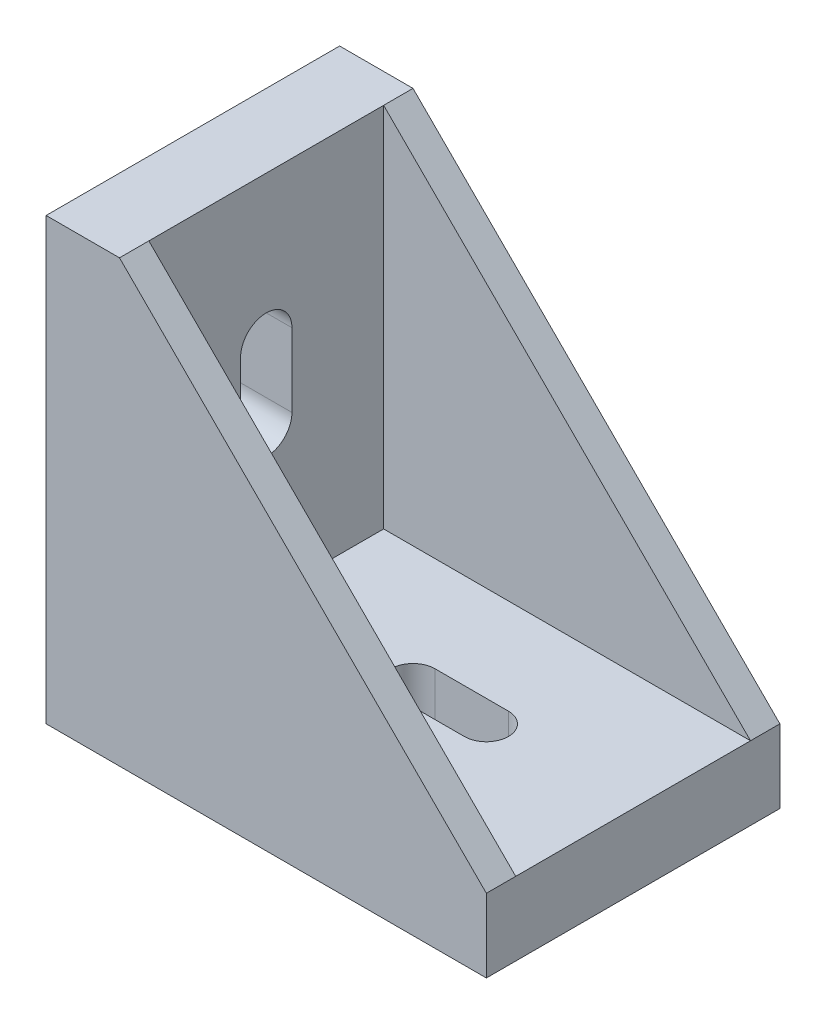
ISO-10303-21;
HEADER;
FILE_DESCRIPTION(('STEP AP214'),'2;1');
FILE_NAME('part.step','',(''),(''),'','','');
FILE_SCHEMA(('AUTOMOTIVE_DESIGN { 1 0 10303 214 1 1 1 1 }'));
ENDSEC;
DATA;
#1=APPLICATION_CONTEXT('core data for automotive mechanical design processes');
#2=APPLICATION_PROTOCOL_DEFINITION('international standard','automotive_design',2000,#1);
#3=PRODUCT_CONTEXT('',#1,'mechanical');
#4=PRODUCT('Part','Part','',(#3));
#5=PRODUCT_RELATED_PRODUCT_CATEGORY('part','',(#4));
#6=PRODUCT_DEFINITION_FORMATION('','',#4);
#7=PRODUCT_DEFINITION_CONTEXT('part definition',#1,'design');
#8=PRODUCT_DEFINITION('design','',#6,#7);
#9=PRODUCT_DEFINITION_SHAPE('','',#8);
#10=(LENGTH_UNIT() NAMED_UNIT(*) SI_UNIT(.MILLI.,.METRE.));
#11=(NAMED_UNIT(*) PLANE_ANGLE_UNIT() SI_UNIT($,.RADIAN.));
#12=(NAMED_UNIT(*) SI_UNIT($,.STERADIAN.) SOLID_ANGLE_UNIT());
#13=UNCERTAINTY_MEASURE_WITH_UNIT(LENGTH_MEASURE(1.E-05),#10,'distance_accuracy_value','');
#14=(GEOMETRIC_REPRESENTATION_CONTEXT(3) GLOBAL_UNCERTAINTY_ASSIGNED_CONTEXT((#13)) GLOBAL_UNIT_ASSIGNED_CONTEXT((#10,
#11,#12)) REPRESENTATION_CONTEXT('',''));
#15=CARTESIAN_POINT('',(0.,0.,0.));
#16=DIRECTION('',(0.,0.,1.));
#17=DIRECTION('',(1.,0.,0.));
#18=AXIS2_PLACEMENT_3D('',#15,#16,#17);
#19=CARTESIAN_POINT('',(30.,-25.,-20.));
#20=DIRECTION('',(0.707106781186547,0.707106781186548,0.));
#21=DIRECTION('',(-0.707106781186548,0.707106781186547,0.));
#22=AXIS2_PLACEMENT_3D('',#19,#20,#21);
#23=PLANE('',#22);
#24=DIRECTION('',(0.707106781186548,-0.707106781186547,0.));
#25=VECTOR('',#24,1.);
#26=CARTESIAN_POINT('',(30.,-25.,-2.));
#27=LINE('',#26,#25);
#28=CARTESIAN_POINT('',(5.,0.,-2.));
#29=VERTEX_POINT('',#28);
#30=CARTESIAN_POINT('',(30.,-25.,-2.00000000000001));
#31=VERTEX_POINT('',#30);
#32=EDGE_CURVE('E11',#29,#31,#27,.T.);
#33=ORIENTED_EDGE('',*,*,#32,.F.);
#34=DIRECTION('',(0.,0.,1.));
#35=VECTOR('',#34,1.);
#36=CARTESIAN_POINT('',(5.,0.,-20.));
#37=LINE('',#36,#35);
#38=CARTESIAN_POINT('',(5.,0.,0.));
#39=VERTEX_POINT('',#38);
#40=EDGE_CURVE('E269',#29,#39,#37,.T.);
#41=ORIENTED_EDGE('',*,*,#40,.T.);
#42=DIRECTION('',(-0.707106781186548,0.707106781186547,0.));
#43=VECTOR('',#42,1.);
#44=CARTESIAN_POINT('',(30.,-25.,0.));
#45=LINE('',#44,#43);
#46=CARTESIAN_POINT('',(30.,-25.,0.));
#47=VERTEX_POINT('',#46);
#48=EDGE_CURVE('E240',#47,#39,#45,.T.);
#49=ORIENTED_EDGE('',*,*,#48,.F.);
#50=DIRECTION('',(0.,0.,1.));
#51=VECTOR('',#50,1.);
#52=CARTESIAN_POINT('',(30.,-25.,-20.));
#53=LINE('',#52,#51);
#54=EDGE_CURVE('E273',#31,#47,#53,.T.);
#55=ORIENTED_EDGE('',*,*,#54,.F.);
#56=EDGE_LOOP('',(#33,#41,#49,#55));
#57=FACE_BOUND('',#56,.T.);
#58=ADVANCED_FACE('F37',(#57),#23,.T.);
#59=CARTESIAN_POINT('',(5.,0.,-20.));
#60=DIRECTION('',(0.,1.,0.));
#61=DIRECTION('',(-1.,0.,0.));
#62=AXIS2_PLACEMENT_3D('',#59,#60,#61);
#63=PLANE('',#62);
#64=DIRECTION('',(-1.,0.,0.));
#65=VECTOR('',#64,1.);
#66=CARTESIAN_POINT('',(5.,0.,0.));
#67=LINE('',#66,#65);
#68=CARTESIAN_POINT('',(0.,0.,0.));
#69=VERTEX_POINT('',#68);
#70=EDGE_CURVE('E234',#39,#69,#67,.T.);
#71=ORIENTED_EDGE('',*,*,#70,.F.);
#72=ORIENTED_EDGE('',*,*,#40,.F.);
#73=DIRECTION('',(0.,0.,1.));
#74=VECTOR('',#73,1.);
#75=CARTESIAN_POINT('',(5.,0.,-2.));
#76=LINE('',#75,#74);
#77=CARTESIAN_POINT('',(5.,0.,-18.));
#78=VERTEX_POINT('',#77);
#79=EDGE_CURVE('E226',#78,#29,#76,.T.);
#80=ORIENTED_EDGE('',*,*,#79,.F.);
#81=CARTESIAN_POINT('',(5.,0.,-20.));
#82=VERTEX_POINT('',#81);
#83=EDGE_CURVE('E266',#82,#78,#37,.T.);
#84=ORIENTED_EDGE('',*,*,#83,.F.);
#85=DIRECTION('',(-1.,0.,0.));
#86=VECTOR('',#85,1.);
#87=CARTESIAN_POINT('',(5.,0.,-20.));
#88=LINE('',#87,#86);
#89=CARTESIAN_POINT('',(0.,0.,-20.));
#90=VERTEX_POINT('',#89);
#91=EDGE_CURVE('E236',#82,#90,#88,.T.);
#92=ORIENTED_EDGE('',*,*,#91,.T.);
#93=DIRECTION('',(0.,0.,1.));
#94=VECTOR('',#93,1.);
#95=CARTESIAN_POINT('',(0.,0.,-20.));
#96=LINE('',#95,#94);
#97=EDGE_CURVE('E252',#90,#69,#96,.T.);
#98=ORIENTED_EDGE('',*,*,#97,.T.);
#99=EDGE_LOOP('',(#71,#72,#80,#84,#92,#98));
#100=FACE_BOUND('',#99,.T.);
#101=ADVANCED_FACE('F39',(#100),#63,.T.);
#102=DIRECTION('',(-0.707106781186548,0.707106781186547,0.));
#103=VECTOR('',#102,1.);
#104=CARTESIAN_POINT('',(30.,-25.,-18.));
#105=LINE('',#104,#103);
#106=CARTESIAN_POINT('',(30.,-25.,-18.));
#107=VERTEX_POINT('',#106);
#108=EDGE_CURVE('E45',#107,#78,#105,.T.);
#109=ORIENTED_EDGE('',*,*,#108,.F.);
#110=CARTESIAN_POINT('',(30.,-25.,-20.));
#111=VERTEX_POINT('',#110);
#112=EDGE_CURVE('E270',#111,#107,#53,.T.);
#113=ORIENTED_EDGE('',*,*,#112,.F.);
#114=DIRECTION('',(-0.707106781186548,0.707106781186547,0.));
#115=VECTOR('',#114,1.);
#116=CARTESIAN_POINT('',(30.,-25.,-20.));
#117=LINE('',#116,#115);
#118=EDGE_CURVE('E249',#111,#82,#117,.T.);
#119=ORIENTED_EDGE('',*,*,#118,.T.);
#120=ORIENTED_EDGE('',*,*,#83,.T.);
#121=EDGE_LOOP('',(#109,#113,#119,#120));
#122=FACE_BOUND('',#121,.T.);
#123=ADVANCED_FACE('F292',(#122),#23,.T.);
#124=CARTESIAN_POINT('',(30.,-30.,-20.));
#125=DIRECTION('',(1.,0.,0.));
#126=DIRECTION('',(0.,0.,-1.));
#127=AXIS2_PLACEMENT_3D('',#124,#125,#126);
#128=PLANE('',#127);
#129=DIRECTION('',(0.,1.,0.));
#130=VECTOR('',#129,1.);
#131=CARTESIAN_POINT('',(30.,-30.,0.));
#132=LINE('',#131,#130);
#133=CARTESIAN_POINT('',(30.,-30.,0.));
#134=VERTEX_POINT('',#133);
#135=EDGE_CURVE('E261',#134,#47,#132,.T.);
#136=ORIENTED_EDGE('',*,*,#135,.F.);
#137=DIRECTION('',(0.,0.,1.));
#138=VECTOR('',#137,1.);
#139=CARTESIAN_POINT('',(30.,-30.,-20.));
#140=LINE('',#139,#138);
#141=CARTESIAN_POINT('',(30.,-30.,-20.));
#142=VERTEX_POINT('',#141);
#143=EDGE_CURVE('E274',#142,#134,#140,.T.);
#144=ORIENTED_EDGE('',*,*,#143,.F.);
#145=DIRECTION('',(0.,1.,0.));
#146=VECTOR('',#145,1.);
#147=CARTESIAN_POINT('',(30.,-30.,-20.));
#148=LINE('',#147,#146);
#149=EDGE_CURVE('E246',#142,#111,#148,.T.);
#150=ORIENTED_EDGE('',*,*,#149,.T.);
#151=ORIENTED_EDGE('',*,*,#112,.T.);
#152=DIRECTION('',(0.,0.,-1.));
#153=VECTOR('',#152,1.);
#154=CARTESIAN_POINT('',(30.,-25.,-2.));
#155=LINE('',#154,#153);
#156=EDGE_CURVE('E216',#31,#107,#155,.T.);
#157=ORIENTED_EDGE('',*,*,#156,.F.);
#158=ORIENTED_EDGE('',*,*,#54,.T.);
#159=EDGE_LOOP('',(#136,#144,#150,#151,#157,#158));
#160=FACE_BOUND('',#159,.T.);
#161=ADVANCED_FACE('F315',(#160),#128,.T.);
#162=CARTESIAN_POINT('',(0.,-30.,-20.));
#163=DIRECTION('',(0.,-1.,0.));
#164=DIRECTION('',(0.,0.,-1.));
#165=AXIS2_PLACEMENT_3D('',#162,#163,#164);
#166=PLANE('',#165);
#167=CARTESIAN_POINT('',(15.,-30.,-10.));
#168=DIRECTION('',(0.,-1.,0.));
#169=DIRECTION('',(0.,0.,-1.));
#170=AXIS2_PLACEMENT_3D('',#167,#168,#169);
#171=CIRCLE('',#170,1.5);
#172=CARTESIAN_POINT('',(15.,-30.,-11.5));
#173=VERTEX_POINT('',#172);
#174=CARTESIAN_POINT('',(15.,-30.,-8.5));
#175=VERTEX_POINT('',#174);
#176=EDGE_CURVE('E160',#173,#175,#171,.F.);
#177=ORIENTED_EDGE('',*,*,#176,.T.);
#178=DIRECTION('',(1.,0.,0.));
#179=VECTOR('',#178,1.);
#180=CARTESIAN_POINT('',(15.,-30.,-8.5));
#181=LINE('',#180,#179);
#182=CARTESIAN_POINT('',(20.,-30.,-8.5));
#183=VERTEX_POINT('',#182);
#184=EDGE_CURVE('E149',#175,#183,#181,.T.);
#185=ORIENTED_EDGE('',*,*,#184,.T.);
#186=CARTESIAN_POINT('',(20.,-30.,-10.));
#187=DIRECTION('',(0.,-1.,0.));
#188=DIRECTION('',(0.,0.,-1.));
#189=AXIS2_PLACEMENT_3D('',#186,#187,#188);
#190=CIRCLE('',#189,1.5);
#191=CARTESIAN_POINT('',(20.,-30.,-11.5));
#192=VERTEX_POINT('',#191);
#193=EDGE_CURVE('E171',#183,#192,#190,.F.);
#194=ORIENTED_EDGE('',*,*,#193,.T.);
#195=DIRECTION('',(-1.,0.,0.));
#196=VECTOR('',#195,1.);
#197=CARTESIAN_POINT('',(15.,-30.,-11.5));
#198=LINE('',#197,#196);
#199=EDGE_CURVE('E167',#192,#173,#198,.T.);
#200=ORIENTED_EDGE('',*,*,#199,.T.);
#201=EDGE_LOOP('',(#177,#185,#194,#200));
#202=FACE_BOUND('',#201,.T.);
#203=DIRECTION('',(1.,0.,0.));
#204=VECTOR('',#203,1.);
#205=CARTESIAN_POINT('',(0.,-30.,0.));
#206=LINE('',#205,#204);
#207=CARTESIAN_POINT('',(0.,-30.,0.));
#208=VERTEX_POINT('',#207);
#209=EDGE_CURVE('E258',#208,#134,#206,.T.);
#210=ORIENTED_EDGE('',*,*,#209,.F.);
#211=DIRECTION('',(0.,0.,1.));
#212=VECTOR('',#211,1.);
#213=CARTESIAN_POINT('',(0.,-30.,-20.));
#214=LINE('',#213,#212);
#215=CARTESIAN_POINT('',(0.,-30.,-20.));
#216=VERTEX_POINT('',#215);
#217=EDGE_CURVE('E276',#216,#208,#214,.T.);
#218=ORIENTED_EDGE('',*,*,#217,.F.);
#219=DIRECTION('',(1.,0.,0.));
#220=VECTOR('',#219,1.);
#221=CARTESIAN_POINT('',(0.,-30.,-20.));
#222=LINE('',#221,#220);
#223=EDGE_CURVE('E243',#216,#142,#222,.T.);
#224=ORIENTED_EDGE('',*,*,#223,.T.);
#225=ORIENTED_EDGE('',*,*,#143,.T.);
#226=EDGE_LOOP('',(#210,#218,#224,#225));
#227=FACE_BOUND('',#226,.T.);
#228=ADVANCED_FACE('F165',(#202,#227),#166,.T.);
#229=CARTESIAN_POINT('',(0.,0.,-20.));
#230=DIRECTION('',(-1.,0.,0.));
#231=DIRECTION('',(0.,0.,1.));
#232=AXIS2_PLACEMENT_3D('',#229,#230,#231);
#233=PLANE('',#232);
#234=CARTESIAN_POINT('',(0.,-10.,-10.));
#235=DIRECTION('',(-1.,0.,0.));
#236=DIRECTION('',(0.,0.,1.));
#237=AXIS2_PLACEMENT_3D('',#234,#235,#236);
#238=CIRCLE('',#237,1.75);
#239=CARTESIAN_POINT('',(0.,-10.,-11.75));
#240=VERTEX_POINT('',#239);
#241=CARTESIAN_POINT('',(0.,-10.,-8.25));
#242=VERTEX_POINT('',#241);
#243=EDGE_CURVE('E190',#240,#242,#238,.F.);
#244=ORIENTED_EDGE('',*,*,#243,.T.);
#245=DIRECTION('',(0.,-1.,0.));
#246=VECTOR('',#245,1.);
#247=CARTESIAN_POINT('',(0.,-10.,-8.25));
#248=LINE('',#247,#246);
#249=CARTESIAN_POINT('',(0.,-15.,-8.25));
#250=VERTEX_POINT('',#249);
#251=EDGE_CURVE('E207',#242,#250,#248,.T.);
#252=ORIENTED_EDGE('',*,*,#251,.T.);
#253=CARTESIAN_POINT('',(0.,-15.,-10.));
#254=DIRECTION('',(-1.,0.,0.));
#255=DIRECTION('',(0.,0.,1.));
#256=AXIS2_PLACEMENT_3D('',#253,#254,#255);
#257=CIRCLE('',#256,1.75);
#258=CARTESIAN_POINT('',(0.,-15.,-11.75));
#259=VERTEX_POINT('',#258);
#260=EDGE_CURVE('E156',#250,#259,#257,.F.);
#261=ORIENTED_EDGE('',*,*,#260,.T.);
#262=DIRECTION('',(0.,1.,0.));
#263=VECTOR('',#262,1.);
#264=CARTESIAN_POINT('',(0.,-10.,-11.75));
#265=LINE('',#264,#263);
#266=EDGE_CURVE('E187',#259,#240,#265,.T.);
#267=ORIENTED_EDGE('',*,*,#266,.T.);
#268=EDGE_LOOP('',(#244,#252,#261,#267));
#269=FACE_BOUND('',#268,.T.);
#270=DIRECTION('',(0.,-1.,0.));
#271=VECTOR('',#270,1.);
#272=CARTESIAN_POINT('',(0.,0.,0.));
#273=LINE('',#272,#271);
#274=EDGE_CURVE('E255',#69,#208,#273,.T.);
#275=ORIENTED_EDGE('',*,*,#274,.F.);
#276=ORIENTED_EDGE('',*,*,#97,.F.);
#277=DIRECTION('',(0.,-1.,0.));
#278=VECTOR('',#277,1.);
#279=CARTESIAN_POINT('',(0.,0.,-20.));
#280=LINE('',#279,#278);
#281=EDGE_CURVE('E239',#90,#216,#280,.T.);
#282=ORIENTED_EDGE('',*,*,#281,.T.);
#283=ORIENTED_EDGE('',*,*,#217,.T.);
#284=EDGE_LOOP('',(#275,#276,#282,#283));
#285=FACE_BOUND('',#284,.T.);
#286=ADVANCED_FACE('F301',(#269,#285),#233,.T.);
#287=CARTESIAN_POINT('',(0.,0.,-20.));
#288=DIRECTION('',(0.,0.,1.));
#289=DIRECTION('',(1.,0.,0.));
#290=AXIS2_PLACEMENT_3D('',#287,#288,#289);
#291=PLANE('',#290);
#292=ORIENTED_EDGE('',*,*,#91,.F.);
#293=ORIENTED_EDGE('',*,*,#118,.F.);
#294=ORIENTED_EDGE('',*,*,#149,.F.);
#295=ORIENTED_EDGE('',*,*,#223,.F.);
#296=ORIENTED_EDGE('',*,*,#281,.F.);
#297=EDGE_LOOP('',(#292,#293,#294,#295,#296));
#298=FACE_BOUND('',#297,.T.);
#299=ADVANCED_FACE('F296',(#298),#291,.F.);
#300=CARTESIAN_POINT('',(0.,0.,0.));
#301=DIRECTION('',(0.,0.,1.));
#302=DIRECTION('',(1.,0.,0.));
#303=AXIS2_PLACEMENT_3D('',#300,#301,#302);
#304=PLANE('',#303);
#305=ORIENTED_EDGE('',*,*,#70,.T.);
#306=ORIENTED_EDGE('',*,*,#274,.T.);
#307=ORIENTED_EDGE('',*,*,#209,.T.);
#308=ORIENTED_EDGE('',*,*,#135,.T.);
#309=ORIENTED_EDGE('',*,*,#48,.T.);
#310=EDGE_LOOP('',(#305,#306,#307,#308,#309));
#311=FACE_BOUND('',#310,.T.);
#312=ADVANCED_FACE('F304',(#311),#304,.T.);
#313=CARTESIAN_POINT('',(5.,0.,-2.));
#314=DIRECTION('',(0.,0.,1.));
#315=DIRECTION('',(0.,-1.,0.));
#316=AXIS2_PLACEMENT_3D('',#313,#314,#315);
#317=PLANE('',#316);
#318=ORIENTED_EDGE('',*,*,#32,.T.);
#319=DIRECTION('',(1.,0.,0.));
#320=VECTOR('',#319,1.);
#321=CARTESIAN_POINT('',(5.,-25.,-2.));
#322=LINE('',#321,#320);
#323=CARTESIAN_POINT('',(5.,-25.,-2.));
#324=VERTEX_POINT('',#323);
#325=EDGE_CURVE('E229',#324,#31,#322,.T.);
#326=ORIENTED_EDGE('',*,*,#325,.F.);
#327=DIRECTION('',(0.,-1.,0.));
#328=VECTOR('',#327,1.);
#329=CARTESIAN_POINT('',(5.,0.,-2.));
#330=LINE('',#329,#328);
#331=EDGE_CURVE('E217',#29,#324,#330,.T.);
#332=ORIENTED_EDGE('',*,*,#331,.F.);
#333=EDGE_LOOP('',(#318,#326,#332));
#334=FACE_BOUND('',#333,.T.);
#335=ADVANCED_FACE('F311',(#334),#317,.F.);
#336=CARTESIAN_POINT('',(5.,0.,-18.));
#337=DIRECTION('',(0.,0.,-1.));
#338=DIRECTION('',(0.,1.,0.));
#339=AXIS2_PLACEMENT_3D('',#336,#337,#338);
#340=PLANE('',#339);
#341=ORIENTED_EDGE('',*,*,#108,.T.);
#342=DIRECTION('',(0.,1.,0.));
#343=VECTOR('',#342,1.);
#344=CARTESIAN_POINT('',(5.,0.,-18.));
#345=LINE('',#344,#343);
#346=CARTESIAN_POINT('',(5.,-25.,-18.));
#347=VERTEX_POINT('',#346);
#348=EDGE_CURVE('E223',#347,#78,#345,.T.);
#349=ORIENTED_EDGE('',*,*,#348,.F.);
#350=DIRECTION('',(1.,0.,0.));
#351=VECTOR('',#350,1.);
#352=CARTESIAN_POINT('',(5.,-25.,-18.));
#353=LINE('',#352,#351);
#354=EDGE_CURVE('E232',#347,#107,#353,.T.);
#355=ORIENTED_EDGE('',*,*,#354,.T.);
#356=EDGE_LOOP('',(#341,#349,#355));
#357=FACE_BOUND('',#356,.T.);
#358=ADVANCED_FACE('F281',(#357),#340,.F.);
#359=CARTESIAN_POINT('',(5.,-25.,-2.));
#360=DIRECTION('',(0.,-1.,0.));
#361=DIRECTION('',(0.,0.,-1.));
#362=AXIS2_PLACEMENT_3D('',#359,#360,#361);
#363=PLANE('',#362);
#364=DIRECTION('',(1.,0.,0.));
#365=VECTOR('',#364,1.);
#366=CARTESIAN_POINT('',(15.,-25.,-8.5));
#367=LINE('',#366,#365);
#368=CARTESIAN_POINT('',(15.,-25.,-8.5));
#369=VERTEX_POINT('',#368);
#370=CARTESIAN_POINT('',(20.,-25.,-8.5));
#371=VERTEX_POINT('',#370);
#372=EDGE_CURVE('E169',#369,#371,#367,.T.);
#373=ORIENTED_EDGE('',*,*,#372,.F.);
#374=CARTESIAN_POINT('',(15.,-25.,-10.));
#375=DIRECTION('',(0.,1.,0.));
#376=DIRECTION('',(0.,0.,1.));
#377=AXIS2_PLACEMENT_3D('',#374,#375,#376);
#378=CIRCLE('',#377,1.5);
#379=CARTESIAN_POINT('',(15.,-25.,-11.5));
#380=VERTEX_POINT('',#379);
#381=EDGE_CURVE('E60',#380,#369,#378,.T.);
#382=ORIENTED_EDGE('',*,*,#381,.F.);
#383=DIRECTION('',(-1.,0.,0.));
#384=VECTOR('',#383,1.);
#385=CARTESIAN_POINT('',(15.,-25.,-11.5));
#386=LINE('',#385,#384);
#387=CARTESIAN_POINT('',(20.,-25.,-11.5));
#388=VERTEX_POINT('',#387);
#389=EDGE_CURVE('E162',#388,#380,#386,.T.);
#390=ORIENTED_EDGE('',*,*,#389,.F.);
#391=CARTESIAN_POINT('',(20.,-25.,-10.));
#392=DIRECTION('',(0.,1.,0.));
#393=DIRECTION('',(0.,0.,1.));
#394=AXIS2_PLACEMENT_3D('',#391,#392,#393);
#395=CIRCLE('',#394,1.5);
#396=EDGE_CURVE('E176',#371,#388,#395,.T.);
#397=ORIENTED_EDGE('',*,*,#396,.F.);
#398=EDGE_LOOP('',(#373,#382,#390,#397));
#399=FACE_BOUND('',#398,.T.);
#400=ORIENTED_EDGE('',*,*,#156,.T.);
#401=ORIENTED_EDGE('',*,*,#354,.F.);
#402=DIRECTION('',(0.,0.,-1.));
#403=VECTOR('',#402,1.);
#404=CARTESIAN_POINT('',(5.,-25.,-2.));
#405=LINE('',#404,#403);
#406=EDGE_CURVE('E220',#324,#347,#405,.T.);
#407=ORIENTED_EDGE('',*,*,#406,.F.);
#408=ORIENTED_EDGE('',*,*,#325,.T.);
#409=EDGE_LOOP('',(#400,#401,#407,#408));
#410=FACE_BOUND('',#409,.T.);
#411=ADVANCED_FACE('F313',(#399,#410),#363,.F.);
#412=CARTESIAN_POINT('',(5.,0.,0.));
#413=DIRECTION('',(1.,0.,0.));
#414=DIRECTION('',(0.,0.,-1.));
#415=AXIS2_PLACEMENT_3D('',#412,#413,#414);
#416=PLANE('',#415);
#417=CARTESIAN_POINT('',(5.,-10.,-10.));
#418=DIRECTION('',(1.,0.,0.));
#419=DIRECTION('',(0.,0.,-1.));
#420=AXIS2_PLACEMENT_3D('',#417,#418,#419);
#421=CIRCLE('',#420,1.75);
#422=CARTESIAN_POINT('',(5.,-10.,-11.75));
#423=VERTEX_POINT('',#422);
#424=CARTESIAN_POINT('',(5.,-10.,-8.25));
#425=VERTEX_POINT('',#424);
#426=EDGE_CURVE('E193',#423,#425,#421,.T.);
#427=ORIENTED_EDGE('',*,*,#426,.F.);
#428=DIRECTION('',(0.,1.,0.));
#429=VECTOR('',#428,1.);
#430=CARTESIAN_POINT('',(5.,-10.,-11.75));
#431=LINE('',#430,#429);
#432=CARTESIAN_POINT('',(5.,-15.,-11.75));
#433=VERTEX_POINT('',#432);
#434=EDGE_CURVE('E201',#433,#423,#431,.T.);
#435=ORIENTED_EDGE('',*,*,#434,.F.);
#436=CARTESIAN_POINT('',(5.,-15.,-10.));
#437=DIRECTION('',(1.,0.,0.));
#438=DIRECTION('',(0.,0.,-1.));
#439=AXIS2_PLACEMENT_3D('',#436,#437,#438);
#440=CIRCLE('',#439,1.75);
#441=CARTESIAN_POINT('',(5.,-15.,-8.25));
#442=VERTEX_POINT('',#441);
#443=EDGE_CURVE('E198',#442,#433,#440,.T.);
#444=ORIENTED_EDGE('',*,*,#443,.F.);
#445=DIRECTION('',(0.,-1.,0.));
#446=VECTOR('',#445,1.);
#447=CARTESIAN_POINT('',(5.,-10.,-8.25));
#448=LINE('',#447,#446);
#449=EDGE_CURVE('E195',#425,#442,#448,.T.);
#450=ORIENTED_EDGE('',*,*,#449,.F.);
#451=EDGE_LOOP('',(#427,#435,#444,#450));
#452=FACE_BOUND('',#451,.T.);
#453=ORIENTED_EDGE('',*,*,#331,.T.);
#454=ORIENTED_EDGE('',*,*,#406,.T.);
#455=ORIENTED_EDGE('',*,*,#348,.T.);
#456=ORIENTED_EDGE('',*,*,#79,.T.);
#457=EDGE_LOOP('',(#453,#454,#455,#456));
#458=FACE_BOUND('',#457,.T.);
#459=ADVANCED_FACE('F285',(#452,#458),#416,.T.);
#460=CARTESIAN_POINT('',(-0.00100000000000013,-10.,-10.));
#461=DIRECTION('',(1.,0.,0.));
#462=DIRECTION('',(0.,0.,-1.));
#463=AXIS2_PLACEMENT_3D('',#460,#461,#462);
#464=CYLINDRICAL_SURFACE('',#463,1.75);
#465=DIRECTION('',(1.,0.,0.));
#466=VECTOR('',#465,1.);
#467=CARTESIAN_POINT('',(-0.00100000000000013,-10.,-11.75));
#468=LINE('',#467,#466);
#469=EDGE_CURVE('E205',#240,#423,#468,.T.);
#470=ORIENTED_EDGE('',*,*,#469,.T.);
#471=ORIENTED_EDGE('',*,*,#426,.T.);
#472=DIRECTION('',(1.,0.,0.));
#473=VECTOR('',#472,1.);
#474=CARTESIAN_POINT('',(-0.00100000000000013,-10.,-8.25));
#475=LINE('',#474,#473);
#476=EDGE_CURVE('E204',#242,#425,#475,.T.);
#477=ORIENTED_EDGE('',*,*,#476,.F.);
#478=ORIENTED_EDGE('',*,*,#243,.F.);
#479=EDGE_LOOP('',(#470,#471,#477,#478));
#480=FACE_BOUND('',#479,.T.);
#481=ADVANCED_FACE('F377',(#480),#464,.F.);
#482=CARTESIAN_POINT('',(-0.00100000000000013,-10.,-11.75));
#483=DIRECTION('',(0.,0.,-1.));
#484=DIRECTION('',(0.,1.,0.));
#485=AXIS2_PLACEMENT_3D('',#482,#483,#484);
#486=PLANE('',#485);
#487=DIRECTION('',(1.,0.,0.));
#488=VECTOR('',#487,1.);
#489=CARTESIAN_POINT('',(-0.00100000000000013,-15.,-11.75));
#490=LINE('',#489,#488);
#491=EDGE_CURVE('E208',#259,#433,#490,.T.);
#492=ORIENTED_EDGE('',*,*,#491,.T.);
#493=ORIENTED_EDGE('',*,*,#434,.T.);
#494=ORIENTED_EDGE('',*,*,#469,.F.);
#495=ORIENTED_EDGE('',*,*,#266,.F.);
#496=EDGE_LOOP('',(#492,#493,#494,#495));
#497=FACE_BOUND('',#496,.T.);
#498=ADVANCED_FACE('F387',(#497),#486,.F.);
#499=CARTESIAN_POINT('',(-0.00100000000000013,-15.,-10.));
#500=DIRECTION('',(1.,0.,0.));
#501=DIRECTION('',(0.,0.,-1.));
#502=AXIS2_PLACEMENT_3D('',#499,#500,#501);
#503=CYLINDRICAL_SURFACE('',#502,1.75);
#504=DIRECTION('',(1.,0.,0.));
#505=VECTOR('',#504,1.);
#506=CARTESIAN_POINT('',(-0.00100000000000013,-15.,-8.25));
#507=LINE('',#506,#505);
#508=EDGE_CURVE('E210',#250,#442,#507,.T.);
#509=ORIENTED_EDGE('',*,*,#508,.T.);
#510=ORIENTED_EDGE('',*,*,#443,.T.);
#511=ORIENTED_EDGE('',*,*,#491,.F.);
#512=ORIENTED_EDGE('',*,*,#260,.F.);
#513=EDGE_LOOP('',(#509,#510,#511,#512));
#514=FACE_BOUND('',#513,.T.);
#515=ADVANCED_FACE('F397',(#514),#503,.F.);
#516=CARTESIAN_POINT('',(-0.00100000000000013,-10.,-8.25));
#517=DIRECTION('',(0.,0.,1.));
#518=DIRECTION('',(1.,0.,0.));
#519=AXIS2_PLACEMENT_3D('',#516,#517,#518);
#520=PLANE('',#519);
#521=ORIENTED_EDGE('',*,*,#476,.T.);
#522=ORIENTED_EDGE('',*,*,#449,.T.);
#523=ORIENTED_EDGE('',*,*,#508,.F.);
#524=ORIENTED_EDGE('',*,*,#251,.F.);
#525=EDGE_LOOP('',(#521,#522,#523,#524));
#526=FACE_BOUND('',#525,.T.);
#527=ADVANCED_FACE('F407',(#526),#520,.F.);
#528=CARTESIAN_POINT('',(15.,-30.001,-10.));
#529=DIRECTION('',(0.,1.,0.));
#530=DIRECTION('',(0.,0.,1.));
#531=AXIS2_PLACEMENT_3D('',#528,#529,#530);
#532=CYLINDRICAL_SURFACE('',#531,1.5);
#533=DIRECTION('',(0.,1.,0.));
#534=VECTOR('',#533,1.);
#535=CARTESIAN_POINT('',(15.,-30.001,-11.5));
#536=LINE('',#535,#534);
#537=EDGE_CURVE('E157',#173,#380,#536,.T.);
#538=ORIENTED_EDGE('',*,*,#537,.T.);
#539=ORIENTED_EDGE('',*,*,#381,.T.);
#540=DIRECTION('',(0.,1.,0.));
#541=VECTOR('',#540,1.);
#542=CARTESIAN_POINT('',(15.,-30.001,-8.5));
#543=LINE('',#542,#541);
#544=EDGE_CURVE('E151',#175,#369,#543,.T.);
#545=ORIENTED_EDGE('',*,*,#544,.F.);
#546=ORIENTED_EDGE('',*,*,#176,.F.);
#547=EDGE_LOOP('',(#538,#539,#545,#546));
#548=FACE_BOUND('',#547,.T.);
#549=ADVANCED_FACE('F159',(#548),#532,.F.);
#550=CARTESIAN_POINT('',(15.,-30.001,-11.5));
#551=DIRECTION('',(0.,0.,-1.));
#552=DIRECTION('',(-1.,0.,0.));
#553=AXIS2_PLACEMENT_3D('',#550,#551,#552);
#554=PLANE('',#553);
#555=DIRECTION('',(0.,1.,0.));
#556=VECTOR('',#555,1.);
#557=CARTESIAN_POINT('',(20.,-30.001,-11.5));
#558=LINE('',#557,#556);
#559=EDGE_CURVE('E182',#192,#388,#558,.T.);
#560=ORIENTED_EDGE('',*,*,#559,.T.);
#561=ORIENTED_EDGE('',*,*,#389,.T.);
#562=ORIENTED_EDGE('',*,*,#537,.F.);
#563=ORIENTED_EDGE('',*,*,#199,.F.);
#564=EDGE_LOOP('',(#560,#561,#562,#563));
#565=FACE_BOUND('',#564,.T.);
#566=ADVANCED_FACE('F436',(#565),#554,.F.);
#567=CARTESIAN_POINT('',(20.,-30.001,-10.));
#568=DIRECTION('',(0.,1.,0.));
#569=DIRECTION('',(0.,0.,1.));
#570=AXIS2_PLACEMENT_3D('',#567,#568,#569);
#571=CYLINDRICAL_SURFACE('',#570,1.5);
#572=DIRECTION('',(0.,1.,0.));
#573=VECTOR('',#572,1.);
#574=CARTESIAN_POINT('',(20.,-30.001,-8.5));
#575=LINE('',#574,#573);
#576=EDGE_CURVE('E52',#183,#371,#575,.T.);
#577=ORIENTED_EDGE('',*,*,#576,.T.);
#578=ORIENTED_EDGE('',*,*,#396,.T.);
#579=ORIENTED_EDGE('',*,*,#559,.F.);
#580=ORIENTED_EDGE('',*,*,#193,.F.);
#581=EDGE_LOOP('',(#577,#578,#579,#580));
#582=FACE_BOUND('',#581,.T.);
#583=ADVANCED_FACE('F445',(#582),#571,.F.);
#584=CARTESIAN_POINT('',(15.,-30.001,-8.5));
#585=DIRECTION('',(0.,0.,1.));
#586=DIRECTION('',(1.,0.,0.));
#587=AXIS2_PLACEMENT_3D('',#584,#585,#586);
#588=PLANE('',#587);
#589=ORIENTED_EDGE('',*,*,#544,.T.);
#590=ORIENTED_EDGE('',*,*,#372,.T.);
#591=ORIENTED_EDGE('',*,*,#576,.F.);
#592=ORIENTED_EDGE('',*,*,#184,.F.);
#593=EDGE_LOOP('',(#589,#590,#591,#592));
#594=FACE_BOUND('',#593,.T.);
#595=ADVANCED_FACE('F150',(#594),#588,.F.);
#596=CLOSED_SHELL('',(#58,#101,#123,#161,#228,#286,#299,#312,#335,#358,#411,#459,#481,#498,#515,
#527,#549,#566,#583,#595));
#597=MANIFOLD_SOLID_BREP('B2',#596);
#598=ADVANCED_BREP_SHAPE_REPRESENTATION('',(#18,#597),#14);
#599=SHAPE_DEFINITION_REPRESENTATION(#9,#598);
ENDSEC;
END-ISO-10303-21;
